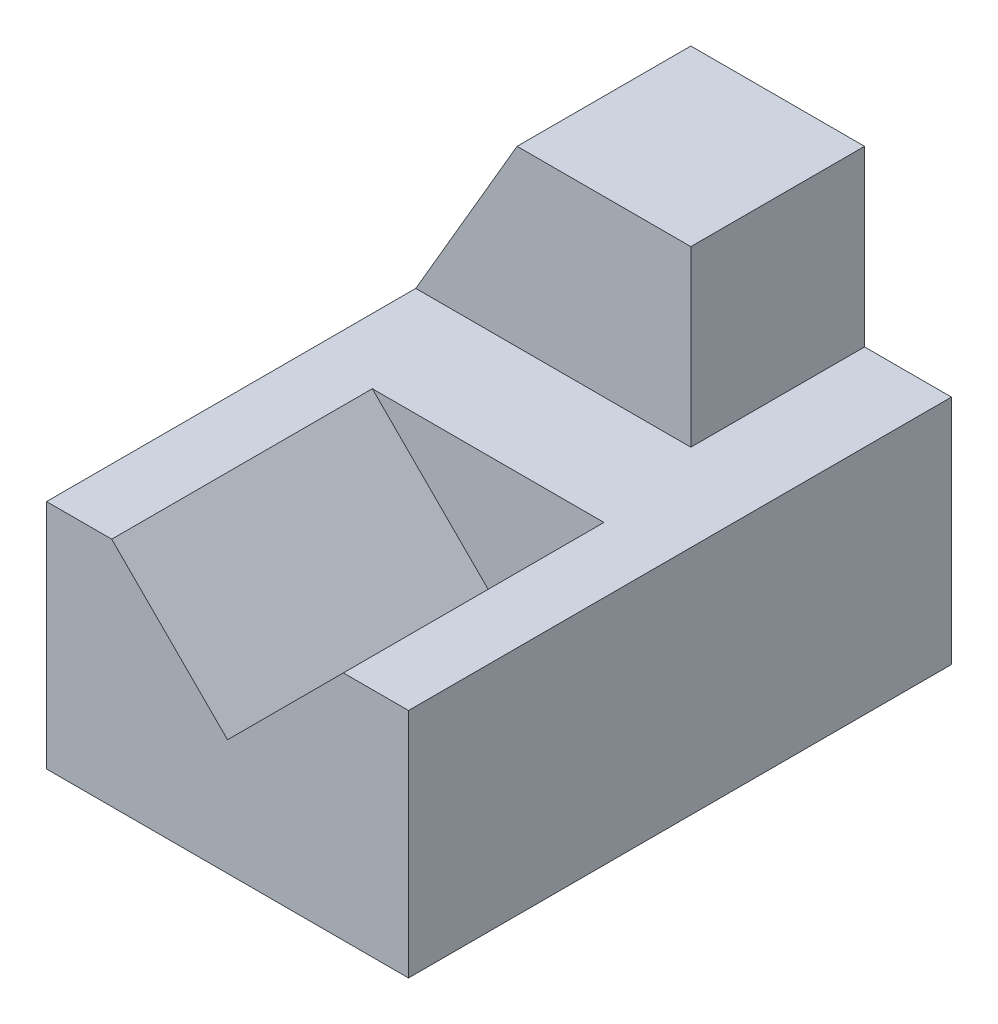
ISO-10303-21;
HEADER;
FILE_DESCRIPTION(('STEP AP214'),'2;1');
FILE_NAME('part.step','',(''),(''),'','','');
FILE_SCHEMA(('AUTOMOTIVE_DESIGN { 1 0 10303 214 1 1 1 1 }'));
ENDSEC;
DATA;
#1=APPLICATION_CONTEXT('core data for automotive mechanical design processes');
#2=APPLICATION_PROTOCOL_DEFINITION('international standard','automotive_design',2000,#1);
#3=PRODUCT_CONTEXT('',#1,'mechanical');
#4=PRODUCT('Part','Part','',(#3));
#5=PRODUCT_RELATED_PRODUCT_CATEGORY('part','',(#4));
#6=PRODUCT_DEFINITION_FORMATION('','',#4);
#7=PRODUCT_DEFINITION_CONTEXT('part definition',#1,'design');
#8=PRODUCT_DEFINITION('design','',#6,#7);
#9=PRODUCT_DEFINITION_SHAPE('','',#8);
#10=(LENGTH_UNIT() NAMED_UNIT(*) SI_UNIT(.MILLI.,.METRE.));
#11=(NAMED_UNIT(*) PLANE_ANGLE_UNIT() SI_UNIT($,.RADIAN.));
#12=(NAMED_UNIT(*) SI_UNIT($,.STERADIAN.) SOLID_ANGLE_UNIT());
#13=UNCERTAINTY_MEASURE_WITH_UNIT(LENGTH_MEASURE(1.E-05),#10,'distance_accuracy_value','');
#14=(GEOMETRIC_REPRESENTATION_CONTEXT(3) GLOBAL_UNCERTAINTY_ASSIGNED_CONTEXT((#13)) GLOBAL_UNIT_ASSIGNED_CONTEXT((#10,
#11,#12)) REPRESENTATION_CONTEXT('',''));
#15=CARTESIAN_POINT('',(0.,0.,0.));
#16=DIRECTION('',(0.,0.,1.));
#17=DIRECTION('',(1.,0.,0.));
#18=AXIS2_PLACEMENT_3D('',#15,#16,#17);
#19=CARTESIAN_POINT('',(0.,32.,75.));
#20=DIRECTION('',(0.,-1.,0.));
#21=DIRECTION('',(1.,0.,0.));
#22=AXIS2_PLACEMENT_3D('',#19,#20,#21);
#23=PLANE('',#22);
#24=DIRECTION('',(0.,0.,-1.));
#25=VECTOR('',#24,1.);
#26=CARTESIAN_POINT('',(-12.,32.,24.));
#27=LINE('',#26,#25);
#28=CARTESIAN_POINT('',(-12.,32.,24.));
#29=VERTEX_POINT('',#28);
#30=CARTESIAN_POINT('',(-12.,32.,0.));
#31=VERTEX_POINT('',#30);
#32=EDGE_CURVE('E217',#29,#31,#27,.T.);
#33=ORIENTED_EDGE('',*,*,#32,.F.);
#34=DIRECTION('',(-1.,0.,0.));
#35=VECTOR('',#34,1.);
#36=CARTESIAN_POINT('',(0.,32.,24.));
#37=LINE('',#36,#35);
#38=CARTESIAN_POINT('',(-50.,32.,24.));
#39=VERTEX_POINT('',#38);
#40=EDGE_CURVE('E201',#29,#39,#37,.T.);
#41=ORIENTED_EDGE('',*,*,#40,.T.);
#42=DIRECTION('',(0.,0.,-1.));
#43=VECTOR('',#42,1.);
#44=CARTESIAN_POINT('',(-50.,32.,75.));
#45=LINE('',#44,#43);
#46=CARTESIAN_POINT('',(-50.,32.,75.));
#47=VERTEX_POINT('',#46);
#48=EDGE_CURVE('E158',#47,#39,#45,.T.);
#49=ORIENTED_EDGE('',*,*,#48,.F.);
#50=DIRECTION('',(-1.,0.,0.));
#51=VECTOR('',#50,1.);
#52=CARTESIAN_POINT('',(0.,32.,75.));
#53=LINE('',#52,#51);
#54=CARTESIAN_POINT('',(-41.,32.,75.));
#55=VERTEX_POINT('',#54);
#56=EDGE_CURVE('E132',#55,#47,#53,.T.);
#57=ORIENTED_EDGE('',*,*,#56,.F.);
#58=DIRECTION('',(0.,0.,-1.));
#59=VECTOR('',#58,1.);
#60=CARTESIAN_POINT('',(-41.,32.,75.));
#61=LINE('',#60,#59);
#62=CARTESIAN_POINT('',(-41.,32.,39.));
#63=VERTEX_POINT('',#62);
#64=EDGE_CURVE('E54',#55,#63,#61,.T.);
#65=ORIENTED_EDGE('',*,*,#64,.T.);
#66=DIRECTION('',(-1.,0.,0.));
#67=VECTOR('',#66,1.);
#68=CARTESIAN_POINT('',(0.,32.,39.));
#69=LINE('',#68,#67);
#70=CARTESIAN_POINT('',(-8.99999999999999,32.,39.));
#71=VERTEX_POINT('',#70);
#72=EDGE_CURVE('E145',#71,#63,#69,.T.);
#73=ORIENTED_EDGE('',*,*,#72,.F.);
#74=DIRECTION('',(0.,0.,-1.));
#75=VECTOR('',#74,1.);
#76=CARTESIAN_POINT('',(-8.99999999999999,32.,75.));
#77=LINE('',#76,#75);
#78=CARTESIAN_POINT('',(-8.99999999999999,32.,75.));
#79=VERTEX_POINT('',#78);
#80=EDGE_CURVE('E150',#79,#71,#77,.T.);
#81=ORIENTED_EDGE('',*,*,#80,.F.);
#82=CARTESIAN_POINT('',(0.,32.,75.));
#83=VERTEX_POINT('',#82);
#84=EDGE_CURVE('E70',#83,#79,#53,.T.);
#85=ORIENTED_EDGE('',*,*,#84,.F.);
#86=DIRECTION('',(0.,0.,-1.));
#87=VECTOR('',#86,1.);
#88=CARTESIAN_POINT('',(0.,32.,75.));
#89=LINE('',#88,#87);
#90=CARTESIAN_POINT('',(0.,32.,0.));
#91=VERTEX_POINT('',#90);
#92=EDGE_CURVE('E119',#83,#91,#89,.T.);
#93=ORIENTED_EDGE('',*,*,#92,.T.);
#94=DIRECTION('',(-1.,0.,0.));
#95=VECTOR('',#94,1.);
#96=CARTESIAN_POINT('',(0.,32.,0.));
#97=LINE('',#96,#95);
#98=EDGE_CURVE('E136',#91,#31,#97,.T.);
#99=ORIENTED_EDGE('',*,*,#98,.T.);
#100=EDGE_LOOP('',(#33,#41,#49,#57,#65,#73,#81,#85,#93,#99));
#101=FACE_BOUND('',#100,.T.);
#102=ADVANCED_FACE('F45',(#101),#23,.F.);
#103=CARTESIAN_POINT('',(-20.5,20.5,75.));
#104=DIRECTION('',(-0.707106781186548,0.707106781186548,0.));
#105=DIRECTION('',(-0.707106781186548,-0.707106781186548,0.));
#106=AXIS2_PLACEMENT_3D('',#103,#104,#105);
#107=PLANE('',#106);
#108=DIRECTION('',(0.707106781186548,0.707106781186548,0.));
#109=VECTOR('',#108,1.);
#110=CARTESIAN_POINT('',(-20.5,20.5,39.));
#111=LINE('',#110,#109);
#112=CARTESIAN_POINT('',(-25.,16.,39.));
#113=VERTEX_POINT('',#112);
#114=EDGE_CURVE('E182',#113,#71,#111,.T.);
#115=ORIENTED_EDGE('',*,*,#114,.F.);
#116=DIRECTION('',(0.,0.,-1.));
#117=VECTOR('',#116,1.);
#118=CARTESIAN_POINT('',(-25.,16.,75.));
#119=LINE('',#118,#117);
#120=CARTESIAN_POINT('',(-25.,16.,75.));
#121=VERTEX_POINT('',#120);
#122=EDGE_CURVE('E11',#121,#113,#119,.T.);
#123=ORIENTED_EDGE('',*,*,#122,.F.);
#124=DIRECTION('',(0.707106781186548,0.707106781186548,0.));
#125=VECTOR('',#124,1.);
#126=CARTESIAN_POINT('',(-20.5,20.5,75.));
#127=LINE('',#126,#125);
#128=EDGE_CURVE('E140',#121,#79,#127,.T.);
#129=ORIENTED_EDGE('',*,*,#128,.T.);
#130=ORIENTED_EDGE('',*,*,#80,.T.);
#131=EDGE_LOOP('',(#115,#123,#129,#130));
#132=FACE_BOUND('',#131,.T.);
#133=ADVANCED_FACE('F47',(#132),#107,.T.);
#134=CARTESIAN_POINT('',(-4.5,-4.5,75.));
#135=DIRECTION('',(0.707106781186547,0.707106781186548,0.));
#136=DIRECTION('',(-0.707106781186548,0.707106781186547,0.));
#137=AXIS2_PLACEMENT_3D('',#134,#135,#136);
#138=PLANE('',#137);
#139=DIRECTION('',(0.707106781186548,-0.707106781186547,0.));
#140=VECTOR('',#139,1.);
#141=CARTESIAN_POINT('',(-4.5,-4.5,39.));
#142=LINE('',#141,#140);
#143=EDGE_CURVE('E177',#63,#113,#142,.T.);
#144=ORIENTED_EDGE('',*,*,#143,.F.);
#145=ORIENTED_EDGE('',*,*,#64,.F.);
#146=DIRECTION('',(0.707106781186548,-0.707106781186547,0.));
#147=VECTOR('',#146,1.);
#148=CARTESIAN_POINT('',(-4.5,-4.5,75.));
#149=LINE('',#148,#147);
#150=EDGE_CURVE('E175',#55,#121,#149,.T.);
#151=ORIENTED_EDGE('',*,*,#150,.T.);
#152=ORIENTED_EDGE('',*,*,#122,.T.);
#153=EDGE_LOOP('',(#144,#145,#151,#152));
#154=FACE_BOUND('',#153,.T.);
#155=ADVANCED_FACE('F174',(#154),#138,.T.);
#156=CARTESIAN_POINT('',(-50.,0.,75.));
#157=DIRECTION('',(-1.,0.,0.));
#158=DIRECTION('',(0.,0.,1.));
#159=AXIS2_PLACEMENT_3D('',#156,#157,#158);
#160=PLANE('',#159);
#161=DIRECTION('',(0.,1.,0.));
#162=VECTOR('',#161,1.);
#163=CARTESIAN_POINT('',(-50.,0.,0.));
#164=LINE('',#163,#162);
#165=CARTESIAN_POINT('',(-50.,0.,0.));
#166=VERTEX_POINT('',#165);
#167=CARTESIAN_POINT('',(-50.,32.,0.));
#168=VERTEX_POINT('',#167);
#169=EDGE_CURVE('E141',#166,#168,#164,.T.);
#170=ORIENTED_EDGE('',*,*,#169,.F.);
#171=DIRECTION('',(0.,0.,-1.));
#172=VECTOR('',#171,1.);
#173=CARTESIAN_POINT('',(-50.,0.,75.));
#174=LINE('',#173,#172);
#175=CARTESIAN_POINT('',(-50.,0.,75.));
#176=VERTEX_POINT('',#175);
#177=EDGE_CURVE('E118',#176,#166,#174,.T.);
#178=ORIENTED_EDGE('',*,*,#177,.F.);
#179=DIRECTION('',(0.,1.,0.));
#180=VECTOR('',#179,1.);
#181=CARTESIAN_POINT('',(-50.,0.,75.));
#182=LINE('',#181,#180);
#183=EDGE_CURVE('E128',#176,#47,#182,.T.);
#184=ORIENTED_EDGE('',*,*,#183,.T.);
#185=ORIENTED_EDGE('',*,*,#48,.T.);
#186=DIRECTION('',(0.,0.,-1.));
#187=VECTOR('',#186,1.);
#188=CARTESIAN_POINT('',(-50.,32.,24.));
#189=LINE('',#188,#187);
#190=EDGE_CURVE('E61',#39,#168,#189,.T.);
#191=ORIENTED_EDGE('',*,*,#190,.T.);
#192=EDGE_LOOP('',(#170,#178,#184,#185,#191));
#193=FACE_BOUND('',#192,.T.);
#194=ADVANCED_FACE('F204',(#193),#160,.T.);
#195=CARTESIAN_POINT('',(0.,0.,75.));
#196=DIRECTION('',(0.,-1.,0.));
#197=DIRECTION('',(1.,0.,0.));
#198=AXIS2_PLACEMENT_3D('',#195,#196,#197);
#199=PLANE('',#198);
#200=DIRECTION('',(-1.,0.,0.));
#201=VECTOR('',#200,1.);
#202=CARTESIAN_POINT('',(0.,0.,0.));
#203=LINE('',#202,#201);
#204=CARTESIAN_POINT('',(0.,0.,0.));
#205=VERTEX_POINT('',#204);
#206=EDGE_CURVE('E116',#205,#166,#203,.T.);
#207=ORIENTED_EDGE('',*,*,#206,.F.);
#208=DIRECTION('',(0.,0.,-1.));
#209=VECTOR('',#208,1.);
#210=CARTESIAN_POINT('',(0.,0.,75.));
#211=LINE('',#210,#209);
#212=CARTESIAN_POINT('',(0.,0.,75.));
#213=VERTEX_POINT('',#212);
#214=EDGE_CURVE('E110',#213,#205,#211,.T.);
#215=ORIENTED_EDGE('',*,*,#214,.F.);
#216=DIRECTION('',(-1.,0.,0.));
#217=VECTOR('',#216,1.);
#218=CARTESIAN_POINT('',(0.,0.,75.));
#219=LINE('',#218,#217);
#220=EDGE_CURVE('E114',#213,#176,#219,.T.);
#221=ORIENTED_EDGE('',*,*,#220,.T.);
#222=ORIENTED_EDGE('',*,*,#177,.T.);
#223=EDGE_LOOP('',(#207,#215,#221,#222));
#224=FACE_BOUND('',#223,.T.);
#225=ADVANCED_FACE('F112',(#224),#199,.T.);
#226=CARTESIAN_POINT('',(0.,0.,75.));
#227=DIRECTION('',(-1.,0.,0.));
#228=DIRECTION('',(0.,0.,1.));
#229=AXIS2_PLACEMENT_3D('',#226,#227,#228);
#230=PLANE('',#229);
#231=DIRECTION('',(0.,1.,0.));
#232=VECTOR('',#231,1.);
#233=CARTESIAN_POINT('',(0.,0.,0.));
#234=LINE('',#233,#232);
#235=EDGE_CURVE('E88',#205,#91,#234,.T.);
#236=ORIENTED_EDGE('',*,*,#235,.T.);
#237=ORIENTED_EDGE('',*,*,#92,.F.);
#238=DIRECTION('',(0.,1.,0.));
#239=VECTOR('',#238,1.);
#240=CARTESIAN_POINT('',(0.,0.,75.));
#241=LINE('',#240,#239);
#242=EDGE_CURVE('E121',#213,#83,#241,.T.);
#243=ORIENTED_EDGE('',*,*,#242,.F.);
#244=ORIENTED_EDGE('',*,*,#214,.T.);
#245=EDGE_LOOP('',(#236,#237,#243,#244));
#246=FACE_BOUND('',#245,.T.);
#247=ADVANCED_FACE('F122',(#246),#230,.F.);
#248=CARTESIAN_POINT('',(0.,0.,75.));
#249=DIRECTION('',(0.,0.,1.));
#250=DIRECTION('',(1.,0.,0.));
#251=AXIS2_PLACEMENT_3D('',#248,#249,#250);
#252=PLANE('',#251);
#253=ORIENTED_EDGE('',*,*,#128,.F.);
#254=ORIENTED_EDGE('',*,*,#150,.F.);
#255=ORIENTED_EDGE('',*,*,#56,.T.);
#256=ORIENTED_EDGE('',*,*,#183,.F.);
#257=ORIENTED_EDGE('',*,*,#220,.F.);
#258=ORIENTED_EDGE('',*,*,#242,.T.);
#259=ORIENTED_EDGE('',*,*,#84,.T.);
#260=EDGE_LOOP('',(#253,#254,#255,#256,#257,#258,#259));
#261=FACE_BOUND('',#260,.T.);
#262=ADVANCED_FACE('F126',(#261),#252,.T.);
#263=CARTESIAN_POINT('',(0.,0.,0.));
#264=DIRECTION('',(0.,0.,1.));
#265=DIRECTION('',(1.,0.,0.));
#266=AXIS2_PLACEMENT_3D('',#263,#264,#265);
#267=PLANE('',#266);
#268=ORIENTED_EDGE('',*,*,#169,.T.);
#269=DIRECTION('',(-0.503871025524086,-0.863778900898434,0.));
#270=VECTOR('',#269,1.);
#271=CARTESIAN_POINT('',(-51.2331606217617,29.8860103626943,0.));
#272=LINE('',#271,#270);
#273=CARTESIAN_POINT('',(-36.,56.,0.));
#274=VERTEX_POINT('',#273);
#275=EDGE_CURVE('E364',#274,#168,#272,.T.);
#276=ORIENTED_EDGE('',*,*,#275,.F.);
#277=DIRECTION('',(-1.,0.,0.));
#278=VECTOR('',#277,1.);
#279=CARTESIAN_POINT('',(0.,56.,0.));
#280=LINE('',#279,#278);
#281=CARTESIAN_POINT('',(-12.,56.,0.));
#282=VERTEX_POINT('',#281);
#283=EDGE_CURVE('E363',#282,#274,#280,.T.);
#284=ORIENTED_EDGE('',*,*,#283,.F.);
#285=DIRECTION('',(0.,1.,0.));
#286=VECTOR('',#285,1.);
#287=CARTESIAN_POINT('',(-12.,0.,0.));
#288=LINE('',#287,#286);
#289=EDGE_CURVE('E214',#31,#282,#288,.T.);
#290=ORIENTED_EDGE('',*,*,#289,.F.);
#291=ORIENTED_EDGE('',*,*,#98,.F.);
#292=ORIENTED_EDGE('',*,*,#235,.F.);
#293=ORIENTED_EDGE('',*,*,#206,.T.);
#294=EDGE_LOOP('',(#268,#276,#284,#290,#291,#292,#293));
#295=FACE_BOUND('',#294,.T.);
#296=ADVANCED_FACE('F208',(#295),#267,.F.);
#297=CARTESIAN_POINT('',(0.,0.,39.));
#298=DIRECTION('',(0.,0.,1.));
#299=DIRECTION('',(1.,0.,0.));
#300=AXIS2_PLACEMENT_3D('',#297,#298,#299);
#301=PLANE('',#300);
#302=ORIENTED_EDGE('',*,*,#143,.T.);
#303=ORIENTED_EDGE('',*,*,#114,.T.);
#304=ORIENTED_EDGE('',*,*,#72,.T.);
#305=EDGE_LOOP('',(#302,#303,#304));
#306=FACE_BOUND('',#305,.T.);
#307=ADVANCED_FACE('F229',(#306),#301,.T.);
#308=CARTESIAN_POINT('',(0.,56.,24.));
#309=DIRECTION('',(0.,-1.,0.));
#310=DIRECTION('',(0.,0.,-1.));
#311=AXIS2_PLACEMENT_3D('',#308,#309,#310);
#312=PLANE('',#311);
#313=ORIENTED_EDGE('',*,*,#283,.T.);
#314=DIRECTION('',(0.,0.,-1.));
#315=VECTOR('',#314,1.);
#316=CARTESIAN_POINT('',(-36.,56.,24.));
#317=LINE('',#316,#315);
#318=CARTESIAN_POINT('',(-36.,56.,24.));
#319=VERTEX_POINT('',#318);
#320=EDGE_CURVE('E183',#319,#274,#317,.T.);
#321=ORIENTED_EDGE('',*,*,#320,.F.);
#322=DIRECTION('',(-1.,0.,0.));
#323=VECTOR('',#322,1.);
#324=CARTESIAN_POINT('',(0.,56.,24.));
#325=LINE('',#324,#323);
#326=CARTESIAN_POINT('',(-12.,56.,24.));
#327=VERTEX_POINT('',#326);
#328=EDGE_CURVE('E353',#327,#319,#325,.T.);
#329=ORIENTED_EDGE('',*,*,#328,.F.);
#330=DIRECTION('',(0.,0.,-1.));
#331=VECTOR('',#330,1.);
#332=CARTESIAN_POINT('',(-12.,56.,24.));
#333=LINE('',#332,#331);
#334=EDGE_CURVE('E367',#327,#282,#333,.T.);
#335=ORIENTED_EDGE('',*,*,#334,.T.);
#336=EDGE_LOOP('',(#313,#321,#329,#335));
#337=FACE_BOUND('',#336,.T.);
#338=ADVANCED_FACE('F264',(#337),#312,.F.);
#339=CARTESIAN_POINT('',(-51.2331606217617,29.8860103626943,24.));
#340=DIRECTION('',(0.863778900898433,-0.503871025524086,0.));
#341=DIRECTION('',(0.503871025524086,0.863778900898434,0.));
#342=AXIS2_PLACEMENT_3D('',#339,#340,#341);
#343=PLANE('',#342);
#344=ORIENTED_EDGE('',*,*,#275,.T.);
#345=ORIENTED_EDGE('',*,*,#190,.F.);
#346=DIRECTION('',(-0.503871025524086,-0.863778900898434,0.));
#347=VECTOR('',#346,1.);
#348=CARTESIAN_POINT('',(-51.2331606217617,29.8860103626943,24.));
#349=LINE('',#348,#347);
#350=EDGE_CURVE('E355',#319,#39,#349,.T.);
#351=ORIENTED_EDGE('',*,*,#350,.F.);
#352=ORIENTED_EDGE('',*,*,#320,.T.);
#353=EDGE_LOOP('',(#344,#345,#351,#352));
#354=FACE_BOUND('',#353,.T.);
#355=ADVANCED_FACE('F267',(#354),#343,.F.);
#356=CARTESIAN_POINT('',(-12.,0.,24.));
#357=DIRECTION('',(-1.,0.,0.));
#358=DIRECTION('',(0.,0.,1.));
#359=AXIS2_PLACEMENT_3D('',#356,#357,#358);
#360=PLANE('',#359);
#361=ORIENTED_EDGE('',*,*,#289,.T.);
#362=ORIENTED_EDGE('',*,*,#334,.F.);
#363=DIRECTION('',(0.,1.,0.));
#364=VECTOR('',#363,1.);
#365=CARTESIAN_POINT('',(-12.,0.,24.));
#366=LINE('',#365,#364);
#367=EDGE_CURVE('E356',#29,#327,#366,.T.);
#368=ORIENTED_EDGE('',*,*,#367,.F.);
#369=ORIENTED_EDGE('',*,*,#32,.T.);
#370=EDGE_LOOP('',(#361,#362,#368,#369));
#371=FACE_BOUND('',#370,.T.);
#372=ADVANCED_FACE('F276',(#371),#360,.F.);
#373=CARTESIAN_POINT('',(0.,0.,24.));
#374=DIRECTION('',(0.,0.,1.));
#375=DIRECTION('',(1.,0.,0.));
#376=AXIS2_PLACEMENT_3D('',#373,#374,#375);
#377=PLANE('',#376);
#378=ORIENTED_EDGE('',*,*,#328,.T.);
#379=ORIENTED_EDGE('',*,*,#350,.T.);
#380=ORIENTED_EDGE('',*,*,#40,.F.);
#381=ORIENTED_EDGE('',*,*,#367,.T.);
#382=EDGE_LOOP('',(#378,#379,#380,#381));
#383=FACE_BOUND('',#382,.T.);
#384=ADVANCED_FACE('F284',(#383),#377,.T.);
#385=CLOSED_SHELL('',(#102,#133,#155,#194,#225,#247,#262,#296,#307,#338,#355,#372,#384));
#386=MANIFOLD_SOLID_BREP('B2',#385);
#387=ADVANCED_BREP_SHAPE_REPRESENTATION('',(#18,#386),#14);
#388=SHAPE_DEFINITION_REPRESENTATION(#9,#387);
ENDSEC;
END-ISO-10303-21;
